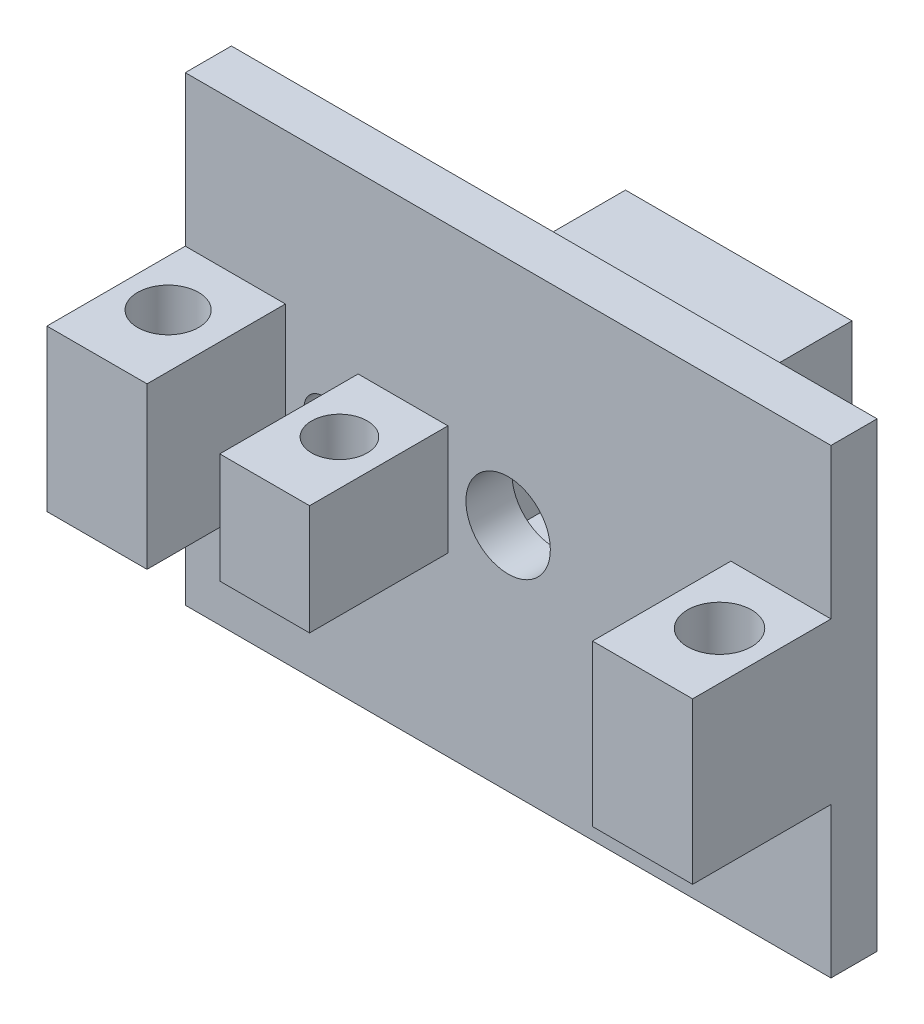
ISO-10303-21;
HEADER;
FILE_DESCRIPTION(('STEP AP214'),'2;1');
FILE_NAME('part.step','',(''),(''),'','','');
FILE_SCHEMA(('AUTOMOTIVE_DESIGN { 1 0 10303 214 1 1 1 1 }'));
ENDSEC;
DATA;
#1=APPLICATION_CONTEXT('core data for automotive mechanical design processes');
#2=APPLICATION_PROTOCOL_DEFINITION('international standard','automotive_design',2000,#1);
#3=PRODUCT_CONTEXT('',#1,'mechanical');
#4=PRODUCT('Part','Part','',(#3));
#5=PRODUCT_RELATED_PRODUCT_CATEGORY('part','',(#4));
#6=PRODUCT_DEFINITION_FORMATION('','',#4);
#7=PRODUCT_DEFINITION_CONTEXT('part definition',#1,'design');
#8=PRODUCT_DEFINITION('design','',#6,#7);
#9=PRODUCT_DEFINITION_SHAPE('','',#8);
#10=(LENGTH_UNIT() NAMED_UNIT(*) SI_UNIT(.MILLI.,.METRE.));
#11=(NAMED_UNIT(*) PLANE_ANGLE_UNIT() SI_UNIT($,.RADIAN.));
#12=(NAMED_UNIT(*) SI_UNIT($,.STERADIAN.) SOLID_ANGLE_UNIT());
#13=UNCERTAINTY_MEASURE_WITH_UNIT(LENGTH_MEASURE(1.E-05),#10,'distance_accuracy_value','');
#14=(GEOMETRIC_REPRESENTATION_CONTEXT(3) GLOBAL_UNCERTAINTY_ASSIGNED_CONTEXT((#13)) GLOBAL_UNIT_ASSIGNED_CONTEXT((#10,
#11,#12)) REPRESENTATION_CONTEXT('',''));
#15=CARTESIAN_POINT('',(0.,0.,0.));
#16=DIRECTION('',(0.,0.,1.));
#17=DIRECTION('',(1.,0.,0.));
#18=AXIS2_PLACEMENT_3D('',#15,#16,#17);
#19=CARTESIAN_POINT('',(0.,0.,10.));
#20=DIRECTION('',(0.,0.,-1.));
#21=DIRECTION('',(-1.,0.,0.));
#22=AXIS2_PLACEMENT_3D('',#19,#20,#21);
#23=PLANE('',#22);
#24=DIRECTION('',(1.,0.,0.));
#25=VECTOR('',#24,1.);
#26=CARTESIAN_POINT('',(48.2903830857398,-17.4173117443862,10.));
#27=LINE('',#26,#25);
#28=CARTESIAN_POINT('',(48.2903830857398,-17.4173117443862,10.));
#29=VERTEX_POINT('',#28);
#30=CARTESIAN_POINT('',(70.,-17.4173117443862,10.));
#31=VERTEX_POINT('',#30);
#32=EDGE_CURVE('E245',#29,#31,#27,.T.);
#33=ORIENTED_EDGE('',*,*,#32,.F.);
#34=DIRECTION('',(0.,-1.,0.));
#35=VECTOR('',#34,1.);
#36=CARTESIAN_POINT('',(48.2903830857398,-17.4173117443862,10.));
#37=LINE('',#36,#35);
#38=CARTESIAN_POINT('',(48.2903830857398,17.4173117443862,10.));
#39=VERTEX_POINT('',#38);
#40=EDGE_CURVE('E249',#39,#29,#37,.T.);
#41=ORIENTED_EDGE('',*,*,#40,.F.);
#42=DIRECTION('',(-1.,0.,0.));
#43=VECTOR('',#42,1.);
#44=CARTESIAN_POINT('',(48.2903830857398,17.4173117443862,10.));
#45=LINE('',#44,#43);
#46=CARTESIAN_POINT('',(70.,17.4173117443862,10.));
#47=VERTEX_POINT('',#46);
#48=EDGE_CURVE('E242',#47,#39,#45,.T.);
#49=ORIENTED_EDGE('',*,*,#48,.F.);
#50=DIRECTION('',(0.,1.,0.));
#51=VECTOR('',#50,1.);
#52=CARTESIAN_POINT('',(70.,-50.,10.));
#53=LINE('',#52,#51);
#54=CARTESIAN_POINT('',(70.,50.,10.));
#55=VERTEX_POINT('',#54);
#56=EDGE_CURVE('E369',#47,#55,#53,.T.);
#57=ORIENTED_EDGE('',*,*,#56,.T.);
#58=DIRECTION('',(-1.,0.,0.));
#59=VECTOR('',#58,1.);
#60=CARTESIAN_POINT('',(-70.,50.,10.));
#61=LINE('',#60,#59);
#62=CARTESIAN_POINT('',(-70.,50.,10.));
#63=VERTEX_POINT('',#62);
#64=EDGE_CURVE('E368',#55,#63,#61,.T.);
#65=ORIENTED_EDGE('',*,*,#64,.T.);
#66=DIRECTION('',(0.,-1.,0.));
#67=VECTOR('',#66,1.);
#68=CARTESIAN_POINT('',(-70.,-50.,10.));
#69=LINE('',#68,#67);
#70=CARTESIAN_POINT('',(-70.,17.4173117443862,10.));
#71=VERTEX_POINT('',#70);
#72=EDGE_CURVE('E372',#63,#71,#69,.T.);
#73=ORIENTED_EDGE('',*,*,#72,.T.);
#74=DIRECTION('',(-1.,0.,0.));
#75=VECTOR('',#74,1.);
#76=CARTESIAN_POINT('',(-48.2903830857398,17.4173117443862,10.));
#77=LINE('',#76,#75);
#78=CARTESIAN_POINT('',(-48.2903830857398,17.4173117443862,10.));
#79=VERTEX_POINT('',#78);
#80=EDGE_CURVE('E264',#79,#71,#77,.T.);
#81=ORIENTED_EDGE('',*,*,#80,.F.);
#82=DIRECTION('',(0.,1.,0.));
#83=VECTOR('',#82,1.);
#84=CARTESIAN_POINT('',(-48.2903830857398,-17.4173117443862,10.));
#85=LINE('',#84,#83);
#86=CARTESIAN_POINT('',(-48.2903830857398,-17.4173117443862,10.));
#87=VERTEX_POINT('',#86);
#88=EDGE_CURVE('E273',#87,#79,#85,.T.);
#89=ORIENTED_EDGE('',*,*,#88,.F.);
#90=DIRECTION('',(1.,0.,0.));
#91=VECTOR('',#90,1.);
#92=CARTESIAN_POINT('',(-48.2903830857398,-17.4173117443862,10.));
#93=LINE('',#92,#91);
#94=CARTESIAN_POINT('',(-70.,-17.4173117443862,10.));
#95=VERTEX_POINT('',#94);
#96=EDGE_CURVE('E252',#95,#87,#93,.T.);
#97=ORIENTED_EDGE('',*,*,#96,.F.);
#98=CARTESIAN_POINT('',(-70.,-50.,10.));
#99=VERTEX_POINT('',#98);
#100=EDGE_CURVE('E371',#95,#99,#69,.T.);
#101=ORIENTED_EDGE('',*,*,#100,.T.);
#102=DIRECTION('',(1.,0.,0.));
#103=VECTOR('',#102,1.);
#104=CARTESIAN_POINT('',(-70.,-50.,10.));
#105=LINE('',#104,#103);
#106=CARTESIAN_POINT('',(70.,-50.,10.));
#107=VERTEX_POINT('',#106);
#108=EDGE_CURVE('E374',#99,#107,#105,.T.);
#109=ORIENTED_EDGE('',*,*,#108,.T.);
#110=EDGE_CURVE('E366',#107,#31,#53,.T.);
#111=ORIENTED_EDGE('',*,*,#110,.T.);
#112=EDGE_LOOP('',(#33,#41,#49,#57,#65,#73,#81,#89,#97,#101,#109,#111));
#113=FACE_BOUND('',#112,.T.);
#114=CARTESIAN_POINT('',(0.,0.,10.));
#115=DIRECTION('',(0.,0.,1.));
#116=DIRECTION('',(1.,0.,0.));
#117=AXIS2_PLACEMENT_3D('',#114,#115,#116);
#118=CIRCLE('',#117,9.15163960888216);
#119=CARTESIAN_POINT('',(9.15163960888217,0.,10.));
#120=VERTEX_POINT('',#119);
#121=EDGE_CURVE('E348',#120,#120,#118,.T.);
#122=ORIENTED_EDGE('',*,*,#121,.F.);
#123=EDGE_LOOP('',(#122));
#124=FACE_BOUND('',#123,.T.);
#125=CARTESIAN_POINT('',(40.,0.,10.));
#126=DIRECTION('',(0.,0.,1.));
#127=DIRECTION('',(-1.,0.,0.));
#128=AXIS2_PLACEMENT_3D('',#125,#126,#127);
#129=CIRCLE('',#128,4.25);
#130=CARTESIAN_POINT('',(35.75,0.,10.));
#131=VERTEX_POINT('',#130);
#132=EDGE_CURVE('E354',#131,#131,#129,.T.);
#133=ORIENTED_EDGE('',*,*,#132,.F.);
#134=EDGE_LOOP('',(#133));
#135=FACE_BOUND('',#134,.T.);
#136=CARTESIAN_POINT('',(-40.,0.,10.));
#137=DIRECTION('',(0.,0.,1.));
#138=DIRECTION('',(1.,0.,0.));
#139=AXIS2_PLACEMENT_3D('',#136,#137,#138);
#140=CIRCLE('',#139,4.25);
#141=CARTESIAN_POINT('',(-35.75,0.,10.));
#142=VERTEX_POINT('',#141);
#143=EDGE_CURVE('E360',#142,#142,#140,.T.);
#144=ORIENTED_EDGE('',*,*,#143,.F.);
#145=EDGE_LOOP('',(#144));
#146=FACE_BOUND('',#145,.T.);
#147=DIRECTION('',(0.,1.,0.));
#148=VECTOR('',#147,1.);
#149=CARTESIAN_POINT('',(-13.0498287945555,-11.7343218596206,10.));
#150=LINE('',#149,#148);
#151=CARTESIAN_POINT('',(-13.0498287945555,-11.7343218596206,10.));
#152=VERTEX_POINT('',#151);
#153=CARTESIAN_POINT('',(-13.0498287945555,12.1552840787998,10.));
#154=VERTEX_POINT('',#153);
#155=EDGE_CURVE('E195',#152,#154,#150,.T.);
#156=ORIENTED_EDGE('',*,*,#155,.F.);
#157=DIRECTION('',(1.,0.,0.));
#158=VECTOR('',#157,1.);
#159=CARTESIAN_POINT('',(-32.519331431594,-11.7343218596206,10.));
#160=LINE('',#159,#158);
#161=CARTESIAN_POINT('',(-32.519331431594,-11.7343218596206,10.));
#162=VERTEX_POINT('',#161);
#163=EDGE_CURVE('E197',#162,#152,#160,.T.);
#164=ORIENTED_EDGE('',*,*,#163,.F.);
#165=DIRECTION('',(0.,-1.,0.));
#166=VECTOR('',#165,1.);
#167=CARTESIAN_POINT('',(-32.519331431594,-11.7343218596206,10.));
#168=LINE('',#167,#166);
#169=CARTESIAN_POINT('',(-32.519331431594,12.1552840787998,10.));
#170=VERTEX_POINT('',#169);
#171=EDGE_CURVE('E58',#170,#162,#168,.T.);
#172=ORIENTED_EDGE('',*,*,#171,.F.);
#173=DIRECTION('',(-1.,0.,0.));
#174=VECTOR('',#173,1.);
#175=CARTESIAN_POINT('',(-32.519331431594,12.1552840787998,10.));
#176=LINE('',#175,#174);
#177=EDGE_CURVE('E53',#154,#170,#176,.T.);
#178=ORIENTED_EDGE('',*,*,#177,.F.);
#179=EDGE_LOOP('',(#156,#164,#172,#178));
#180=FACE_BOUND('',#179,.T.);
#181=ADVANCED_FACE('F37',(#113,#124,#135,#146,#180),#23,.F.);
#182=CARTESIAN_POINT('',(0.,0.,0.));
#183=DIRECTION('',(0.,0.,-1.));
#184=DIRECTION('',(-1.,0.,0.));
#185=AXIS2_PLACEMENT_3D('',#182,#183,#184);
#186=PLANE('',#185);
#187=CARTESIAN_POINT('',(40.,0.,0.));
#188=DIRECTION('',(0.,0.,1.));
#189=DIRECTION('',(-1.,0.,0.));
#190=AXIS2_PLACEMENT_3D('',#187,#188,#189);
#191=CIRCLE('',#190,4.25);
#192=CARTESIAN_POINT('',(35.75,0.,0.));
#193=VERTEX_POINT('',#192);
#194=EDGE_CURVE('E351',#193,#193,#191,.T.);
#195=ORIENTED_EDGE('',*,*,#194,.T.);
#196=EDGE_LOOP('',(#195));
#197=FACE_BOUND('',#196,.T.);
#198=DIRECTION('',(0.,1.,0.));
#199=VECTOR('',#198,1.);
#200=CARTESIAN_POINT('',(70.,-50.,0.));
#201=LINE('',#200,#199);
#202=CARTESIAN_POINT('',(70.,-50.,0.));
#203=VERTEX_POINT('',#202);
#204=CARTESIAN_POINT('',(70.,50.,0.));
#205=VERTEX_POINT('',#204);
#206=EDGE_CURVE('E363',#203,#205,#201,.T.);
#207=ORIENTED_EDGE('',*,*,#206,.F.);
#208=DIRECTION('',(1.,0.,0.));
#209=VECTOR('',#208,1.);
#210=CARTESIAN_POINT('',(-70.,-50.,0.));
#211=LINE('',#210,#209);
#212=CARTESIAN_POINT('',(-70.,-50.,0.));
#213=VERTEX_POINT('',#212);
#214=EDGE_CURVE('E383',#213,#203,#211,.T.);
#215=ORIENTED_EDGE('',*,*,#214,.F.);
#216=DIRECTION('',(0.,-1.,0.));
#217=VECTOR('',#216,1.);
#218=CARTESIAN_POINT('',(-70.,-50.,0.));
#219=LINE('',#218,#217);
#220=CARTESIAN_POINT('',(-70.,50.,0.));
#221=VERTEX_POINT('',#220);
#222=EDGE_CURVE('E381',#221,#213,#219,.T.);
#223=ORIENTED_EDGE('',*,*,#222,.F.);
#224=DIRECTION('',(-1.,0.,0.));
#225=VECTOR('',#224,1.);
#226=CARTESIAN_POINT('',(-70.,50.,0.));
#227=LINE('',#226,#225);
#228=EDGE_CURVE('E379',#205,#221,#227,.T.);
#229=ORIENTED_EDGE('',*,*,#228,.F.);
#230=EDGE_LOOP('',(#207,#215,#223,#229));
#231=FACE_BOUND('',#230,.T.);
#232=CARTESIAN_POINT('',(-40.,0.,0.));
#233=DIRECTION('',(0.,0.,1.));
#234=DIRECTION('',(1.,0.,0.));
#235=AXIS2_PLACEMENT_3D('',#232,#233,#234);
#236=CIRCLE('',#235,4.25);
#237=CARTESIAN_POINT('',(-35.75,0.,0.));
#238=VERTEX_POINT('',#237);
#239=EDGE_CURVE('E357',#238,#238,#236,.T.);
#240=ORIENTED_EDGE('',*,*,#239,.T.);
#241=EDGE_LOOP('',(#240));
#242=FACE_BOUND('',#241,.T.);
#243=DIRECTION('',(-1.,0.,0.));
#244=VECTOR('',#243,1.);
#245=CARTESIAN_POINT('',(24.5535181227437,-25.6722517466818,0.));
#246=LINE('',#245,#244);
#247=CARTESIAN_POINT('',(24.5535181227437,-25.6722517466818,0.));
#248=VERTEX_POINT('',#247);
#249=CARTESIAN_POINT('',(-24.5535181227437,-25.6722517466818,0.));
#250=VERTEX_POINT('',#249);
#251=EDGE_CURVE('E332',#248,#250,#246,.T.);
#252=ORIENTED_EDGE('',*,*,#251,.F.);
#253=DIRECTION('',(0.,-1.,0.));
#254=VECTOR('',#253,1.);
#255=CARTESIAN_POINT('',(24.5535181227437,-25.6722517466818,0.));
#256=LINE('',#255,#254);
#257=CARTESIAN_POINT('',(24.5535181227437,25.6722517466818,0.));
#258=VERTEX_POINT('',#257);
#259=EDGE_CURVE('E318',#258,#248,#256,.T.);
#260=ORIENTED_EDGE('',*,*,#259,.F.);
#261=DIRECTION('',(1.,0.,0.));
#262=VECTOR('',#261,1.);
#263=CARTESIAN_POINT('',(24.5535181227437,25.6722517466818,0.));
#264=LINE('',#263,#262);
#265=CARTESIAN_POINT('',(-24.5535181227437,25.6722517466818,0.));
#266=VERTEX_POINT('',#265);
#267=EDGE_CURVE('E323',#266,#258,#264,.T.);
#268=ORIENTED_EDGE('',*,*,#267,.F.);
#269=DIRECTION('',(0.,1.,0.));
#270=VECTOR('',#269,1.);
#271=CARTESIAN_POINT('',(-24.5535181227437,-25.6722517466818,0.));
#272=LINE('',#271,#270);
#273=EDGE_CURVE('E334',#250,#266,#272,.T.);
#274=ORIENTED_EDGE('',*,*,#273,.F.);
#275=EDGE_LOOP('',(#252,#260,#268,#274));
#276=FACE_BOUND('',#275,.T.);
#277=ADVANCED_FACE('F402',(#197,#231,#242,#276),#186,.T.);
#278=DIRECTION('',(0.,1.,0.));
#279=VECTOR('',#278,1.);
#280=CARTESIAN_POINT('',(-19.5535181227437,-20.6722517466818,0.));
#281=LINE('',#280,#279);
#282=CARTESIAN_POINT('',(-19.5535181227437,-20.6722517466818,0.));
#283=VERTEX_POINT('',#282);
#284=CARTESIAN_POINT('',(-19.5535181227437,20.6722517466818,0.));
#285=VERTEX_POINT('',#284);
#286=EDGE_CURVE('E289',#283,#285,#281,.T.);
#287=ORIENTED_EDGE('',*,*,#286,.T.);
#288=DIRECTION('',(1.,0.,0.));
#289=VECTOR('',#288,1.);
#290=CARTESIAN_POINT('',(19.5535181227437,20.6722517466818,0.));
#291=LINE('',#290,#289);
#292=CARTESIAN_POINT('',(19.5535181227437,20.6722517466818,0.));
#293=VERTEX_POINT('',#292);
#294=EDGE_CURVE('E302',#285,#293,#291,.T.);
#295=ORIENTED_EDGE('',*,*,#294,.T.);
#296=DIRECTION('',(0.,-1.,0.));
#297=VECTOR('',#296,1.);
#298=CARTESIAN_POINT('',(19.5535181227437,-20.6722517466818,0.));
#299=LINE('',#298,#297);
#300=CARTESIAN_POINT('',(19.5535181227437,-20.6722517466818,0.));
#301=VERTEX_POINT('',#300);
#302=EDGE_CURVE('E304',#293,#301,#299,.T.);
#303=ORIENTED_EDGE('',*,*,#302,.T.);
#304=DIRECTION('',(-1.,0.,0.));
#305=VECTOR('',#304,1.);
#306=CARTESIAN_POINT('',(19.5535181227437,-20.6722517466818,0.));
#307=LINE('',#306,#305);
#308=EDGE_CURVE('E293',#301,#283,#307,.T.);
#309=ORIENTED_EDGE('',*,*,#308,.T.);
#310=EDGE_LOOP('',(#287,#295,#303,#309));
#311=FACE_BOUND('',#310,.T.);
#312=CARTESIAN_POINT('',(0.,0.,0.));
#313=DIRECTION('',(0.,0.,1.));
#314=DIRECTION('',(1.,0.,0.));
#315=AXIS2_PLACEMENT_3D('',#312,#313,#314);
#316=CIRCLE('',#315,9.15163960888216);
#317=CARTESIAN_POINT('',(9.15163960888217,0.,0.));
#318=VERTEX_POINT('',#317);
#319=EDGE_CURVE('E347',#318,#318,#316,.T.);
#320=ORIENTED_EDGE('',*,*,#319,.T.);
#321=EDGE_LOOP('',(#320));
#322=FACE_BOUND('',#321,.T.);
#323=ADVANCED_FACE('F436',(#311,#322),#186,.T.);
#324=CARTESIAN_POINT('',(70.,-50.,10.));
#325=DIRECTION('',(-1.,0.,0.));
#326=DIRECTION('',(0.,0.,1.));
#327=AXIS2_PLACEMENT_3D('',#324,#325,#326);
#328=PLANE('',#327);
#329=ORIENTED_EDGE('',*,*,#206,.T.);
#330=DIRECTION('',(0.,0.,-1.));
#331=VECTOR('',#330,1.);
#332=CARTESIAN_POINT('',(70.,50.,10.));
#333=LINE('',#332,#331);
#334=EDGE_CURVE('E11',#55,#205,#333,.T.);
#335=ORIENTED_EDGE('',*,*,#334,.F.);
#336=ORIENTED_EDGE('',*,*,#56,.F.);
#337=DIRECTION('',(0.,0.,-1.));
#338=VECTOR('',#337,1.);
#339=CARTESIAN_POINT('',(70.,17.4173117443862,40.));
#340=LINE('',#339,#338);
#341=CARTESIAN_POINT('',(70.,17.4173117443862,40.));
#342=VERTEX_POINT('',#341);
#343=EDGE_CURVE('E235',#342,#47,#340,.T.);
#344=ORIENTED_EDGE('',*,*,#343,.F.);
#345=DIRECTION('',(0.,1.,0.));
#346=VECTOR('',#345,1.);
#347=CARTESIAN_POINT('',(70.,-17.4173117443862,40.));
#348=LINE('',#347,#346);
#349=CARTESIAN_POINT('',(70.,-17.4173117443862,40.));
#350=VERTEX_POINT('',#349);
#351=EDGE_CURVE('E254',#350,#342,#348,.T.);
#352=ORIENTED_EDGE('',*,*,#351,.F.);
#353=DIRECTION('',(0.,0.,-1.));
#354=VECTOR('',#353,1.);
#355=CARTESIAN_POINT('',(70.,-17.4173117443862,40.));
#356=LINE('',#355,#354);
#357=EDGE_CURVE('E232',#350,#31,#356,.T.);
#358=ORIENTED_EDGE('',*,*,#357,.T.);
#359=ORIENTED_EDGE('',*,*,#110,.F.);
#360=DIRECTION('',(0.,0.,-1.));
#361=VECTOR('',#360,1.);
#362=CARTESIAN_POINT('',(70.,-50.,10.));
#363=LINE('',#362,#361);
#364=EDGE_CURVE('E376',#107,#203,#363,.T.);
#365=ORIENTED_EDGE('',*,*,#364,.T.);
#366=EDGE_LOOP('',(#329,#335,#336,#344,#352,#358,#359,#365));
#367=FACE_BOUND('',#366,.T.);
#368=ADVANCED_FACE('F39',(#367),#328,.F.);
#369=CARTESIAN_POINT('',(-70.,50.,10.));
#370=DIRECTION('',(0.,-1.,0.));
#371=DIRECTION('',(0.,0.,-1.));
#372=AXIS2_PLACEMENT_3D('',#369,#370,#371);
#373=PLANE('',#372);
#374=ORIENTED_EDGE('',*,*,#228,.T.);
#375=DIRECTION('',(0.,0.,-1.));
#376=VECTOR('',#375,1.);
#377=CARTESIAN_POINT('',(-70.,50.,10.));
#378=LINE('',#377,#376);
#379=EDGE_CURVE('E46',#63,#221,#378,.T.);
#380=ORIENTED_EDGE('',*,*,#379,.F.);
#381=ORIENTED_EDGE('',*,*,#64,.F.);
#382=ORIENTED_EDGE('',*,*,#334,.T.);
#383=EDGE_LOOP('',(#374,#380,#381,#382));
#384=FACE_BOUND('',#383,.T.);
#385=ADVANCED_FACE('F427',(#384),#373,.F.);
#386=CARTESIAN_POINT('',(-70.,-50.,10.));
#387=DIRECTION('',(1.,0.,0.));
#388=DIRECTION('',(0.,0.,-1.));
#389=AXIS2_PLACEMENT_3D('',#386,#387,#388);
#390=PLANE('',#389);
#391=ORIENTED_EDGE('',*,*,#222,.T.);
#392=DIRECTION('',(0.,0.,-1.));
#393=VECTOR('',#392,1.);
#394=CARTESIAN_POINT('',(-70.,-50.,10.));
#395=LINE('',#394,#393);
#396=EDGE_CURVE('E387',#99,#213,#395,.T.);
#397=ORIENTED_EDGE('',*,*,#396,.F.);
#398=ORIENTED_EDGE('',*,*,#100,.F.);
#399=DIRECTION('',(0.,0.,-1.));
#400=VECTOR('',#399,1.);
#401=CARTESIAN_POINT('',(-70.,-17.4173117443862,40.));
#402=LINE('',#401,#400);
#403=CARTESIAN_POINT('',(-70.,-17.4173117443862,40.));
#404=VERTEX_POINT('',#403);
#405=EDGE_CURVE('E286',#404,#95,#402,.T.);
#406=ORIENTED_EDGE('',*,*,#405,.F.);
#407=DIRECTION('',(0.,-1.,0.));
#408=VECTOR('',#407,1.);
#409=CARTESIAN_POINT('',(-70.,-17.4173117443862,40.));
#410=LINE('',#409,#408);
#411=CARTESIAN_POINT('',(-70.,17.4173117443862,40.));
#412=VERTEX_POINT('',#411);
#413=EDGE_CURVE('E260',#412,#404,#410,.T.);
#414=ORIENTED_EDGE('',*,*,#413,.F.);
#415=DIRECTION('',(0.,0.,-1.));
#416=VECTOR('',#415,1.);
#417=CARTESIAN_POINT('',(-70.,17.4173117443862,40.));
#418=LINE('',#417,#416);
#419=EDGE_CURVE('E270',#412,#71,#418,.T.);
#420=ORIENTED_EDGE('',*,*,#419,.T.);
#421=ORIENTED_EDGE('',*,*,#72,.F.);
#422=ORIENTED_EDGE('',*,*,#379,.T.);
#423=EDGE_LOOP('',(#391,#397,#398,#406,#414,#420,#421,#422));
#424=FACE_BOUND('',#423,.T.);
#425=ADVANCED_FACE('F395',(#424),#390,.F.);
#426=CARTESIAN_POINT('',(-70.,-50.,10.));
#427=DIRECTION('',(0.,1.,0.));
#428=DIRECTION('',(0.,0.,1.));
#429=AXIS2_PLACEMENT_3D('',#426,#427,#428);
#430=PLANE('',#429);
#431=ORIENTED_EDGE('',*,*,#214,.T.);
#432=ORIENTED_EDGE('',*,*,#364,.F.);
#433=ORIENTED_EDGE('',*,*,#108,.F.);
#434=ORIENTED_EDGE('',*,*,#396,.T.);
#435=EDGE_LOOP('',(#431,#432,#433,#434));
#436=FACE_BOUND('',#435,.T.);
#437=ADVANCED_FACE('F406',(#436),#430,.F.);
#438=CARTESIAN_POINT('',(-40.,0.,10.));
#439=DIRECTION('',(0.,0.,-1.));
#440=DIRECTION('',(-1.,0.,0.));
#441=AXIS2_PLACEMENT_3D('',#438,#439,#440);
#442=CYLINDRICAL_SURFACE('',#441,4.25);
#443=ORIENTED_EDGE('',*,*,#143,.T.);
#444=EDGE_LOOP('',(#443));
#445=FACE_BOUND('',#444,.T.);
#446=ORIENTED_EDGE('',*,*,#239,.F.);
#447=EDGE_LOOP('',(#446));
#448=FACE_BOUND('',#447,.T.);
#449=ADVANCED_FACE('F447',(#445,#448),#442,.F.);
#450=CARTESIAN_POINT('',(40.,0.,10.));
#451=DIRECTION('',(0.,0.,-1.));
#452=DIRECTION('',(-1.,0.,0.));
#453=AXIS2_PLACEMENT_3D('',#450,#451,#452);
#454=CYLINDRICAL_SURFACE('',#453,4.25);
#455=ORIENTED_EDGE('',*,*,#132,.T.);
#456=EDGE_LOOP('',(#455));
#457=FACE_BOUND('',#456,.T.);
#458=ORIENTED_EDGE('',*,*,#194,.F.);
#459=EDGE_LOOP('',(#458));
#460=FACE_BOUND('',#459,.T.);
#461=ADVANCED_FACE('F454',(#457,#460),#454,.F.);
#462=CARTESIAN_POINT('',(0.,0.,10.));
#463=DIRECTION('',(0.,0.,-1.));
#464=DIRECTION('',(-1.,0.,0.));
#465=AXIS2_PLACEMENT_3D('',#462,#463,#464);
#466=CYLINDRICAL_SURFACE('',#465,9.15163960888216);
#467=ORIENTED_EDGE('',*,*,#121,.T.);
#468=EDGE_LOOP('',(#467));
#469=FACE_BOUND('',#468,.T.);
#470=ORIENTED_EDGE('',*,*,#319,.F.);
#471=EDGE_LOOP('',(#470));
#472=FACE_BOUND('',#471,.T.);
#473=ADVANCED_FACE('F459',(#469,#472),#466,.F.);
#474=CARTESIAN_POINT('',(0.,0.,-40.));
#475=DIRECTION('',(0.,0.,1.));
#476=DIRECTION('',(1.,0.,0.));
#477=AXIS2_PLACEMENT_3D('',#474,#475,#476);
#478=PLANE('',#477);
#479=DIRECTION('',(0.,-1.,0.));
#480=VECTOR('',#479,1.);
#481=CARTESIAN_POINT('',(24.5535181227437,-25.6722517466818,-40.));
#482=LINE('',#481,#480);
#483=CARTESIAN_POINT('',(24.5535181227437,25.6722517466818,-40.));
#484=VERTEX_POINT('',#483);
#485=CARTESIAN_POINT('',(24.5535181227437,-25.6722517466818,-40.));
#486=VERTEX_POINT('',#485);
#487=EDGE_CURVE('E319',#484,#486,#482,.T.);
#488=ORIENTED_EDGE('',*,*,#487,.T.);
#489=DIRECTION('',(-1.,0.,0.));
#490=VECTOR('',#489,1.);
#491=CARTESIAN_POINT('',(24.5535181227437,-25.6722517466818,-40.));
#492=LINE('',#491,#490);
#493=CARTESIAN_POINT('',(-24.5535181227437,-25.6722517466818,-40.));
#494=VERTEX_POINT('',#493);
#495=EDGE_CURVE('E322',#486,#494,#492,.T.);
#496=ORIENTED_EDGE('',*,*,#495,.T.);
#497=DIRECTION('',(0.,1.,0.));
#498=VECTOR('',#497,1.);
#499=CARTESIAN_POINT('',(-24.5535181227437,-25.6722517466818,-40.));
#500=LINE('',#499,#498);
#501=CARTESIAN_POINT('',(-24.5535181227437,25.6722517466818,-40.));
#502=VERTEX_POINT('',#501);
#503=EDGE_CURVE('E325',#494,#502,#500,.T.);
#504=ORIENTED_EDGE('',*,*,#503,.T.);
#505=DIRECTION('',(1.,0.,0.));
#506=VECTOR('',#505,1.);
#507=CARTESIAN_POINT('',(24.5535181227437,25.6722517466818,-40.));
#508=LINE('',#507,#506);
#509=EDGE_CURVE('E327',#502,#484,#508,.T.);
#510=ORIENTED_EDGE('',*,*,#509,.T.);
#511=EDGE_LOOP('',(#488,#496,#504,#510));
#512=FACE_BOUND('',#511,.T.);
#513=DIRECTION('',(0.,1.,0.));
#514=VECTOR('',#513,1.);
#515=CARTESIAN_POINT('',(-19.5535181227437,-20.6722517466818,-40.));
#516=LINE('',#515,#514);
#517=CARTESIAN_POINT('',(-19.5535181227437,-20.6722517466818,-40.));
#518=VERTEX_POINT('',#517);
#519=CARTESIAN_POINT('',(-19.5535181227437,20.6722517466818,-40.));
#520=VERTEX_POINT('',#519);
#521=EDGE_CURVE('E290',#518,#520,#516,.T.);
#522=ORIENTED_EDGE('',*,*,#521,.F.);
#523=DIRECTION('',(-1.,0.,0.));
#524=VECTOR('',#523,1.);
#525=CARTESIAN_POINT('',(19.5535181227437,-20.6722517466818,-40.));
#526=LINE('',#525,#524);
#527=CARTESIAN_POINT('',(19.5535181227437,-20.6722517466818,-40.));
#528=VERTEX_POINT('',#527);
#529=EDGE_CURVE('E298',#528,#518,#526,.T.);
#530=ORIENTED_EDGE('',*,*,#529,.F.);
#531=DIRECTION('',(0.,-1.,0.));
#532=VECTOR('',#531,1.);
#533=CARTESIAN_POINT('',(19.5535181227437,-20.6722517466818,-40.));
#534=LINE('',#533,#532);
#535=CARTESIAN_POINT('',(19.5535181227437,20.6722517466818,-40.));
#536=VERTEX_POINT('',#535);
#537=EDGE_CURVE('E295',#536,#528,#534,.T.);
#538=ORIENTED_EDGE('',*,*,#537,.F.);
#539=DIRECTION('',(1.,0.,0.));
#540=VECTOR('',#539,1.);
#541=CARTESIAN_POINT('',(19.5535181227437,20.6722517466818,-40.));
#542=LINE('',#541,#540);
#543=EDGE_CURVE('E292',#520,#536,#542,.T.);
#544=ORIENTED_EDGE('',*,*,#543,.F.);
#545=EDGE_LOOP('',(#522,#530,#538,#544));
#546=FACE_BOUND('',#545,.T.);
#547=ADVANCED_FACE('F479',(#512,#546),#478,.F.);
#548=CARTESIAN_POINT('',(24.5535181227437,-25.6722517466818,-40.));
#549=DIRECTION('',(-1.,0.,0.));
#550=DIRECTION('',(0.,0.,1.));
#551=AXIS2_PLACEMENT_3D('',#548,#549,#550);
#552=PLANE('',#551);
#553=ORIENTED_EDGE('',*,*,#259,.T.);
#554=DIRECTION('',(0.,0.,1.));
#555=VECTOR('',#554,1.);
#556=CARTESIAN_POINT('',(24.5535181227437,-25.6722517466818,-40.));
#557=LINE('',#556,#555);
#558=EDGE_CURVE('E345',#486,#248,#557,.T.);
#559=ORIENTED_EDGE('',*,*,#558,.F.);
#560=ORIENTED_EDGE('',*,*,#487,.F.);
#561=DIRECTION('',(0.,0.,1.));
#562=VECTOR('',#561,1.);
#563=CARTESIAN_POINT('',(24.5535181227437,25.6722517466818,-40.));
#564=LINE('',#563,#562);
#565=EDGE_CURVE('E329',#484,#258,#564,.T.);
#566=ORIENTED_EDGE('',*,*,#565,.T.);
#567=EDGE_LOOP('',(#553,#559,#560,#566));
#568=FACE_BOUND('',#567,.T.);
#569=ADVANCED_FACE('F484',(#568),#552,.F.);
#570=CARTESIAN_POINT('',(24.5535181227437,-25.6722517466818,-40.));
#571=DIRECTION('',(0.,1.,0.));
#572=DIRECTION('',(0.,0.,1.));
#573=AXIS2_PLACEMENT_3D('',#570,#571,#572);
#574=PLANE('',#573);
#575=ORIENTED_EDGE('',*,*,#251,.T.);
#576=DIRECTION('',(0.,0.,1.));
#577=VECTOR('',#576,1.);
#578=CARTESIAN_POINT('',(-24.5535181227437,-25.6722517466818,-40.));
#579=LINE('',#578,#577);
#580=EDGE_CURVE('E342',#494,#250,#579,.T.);
#581=ORIENTED_EDGE('',*,*,#580,.F.);
#582=ORIENTED_EDGE('',*,*,#495,.F.);
#583=ORIENTED_EDGE('',*,*,#558,.T.);
#584=EDGE_LOOP('',(#575,#581,#582,#583));
#585=FACE_BOUND('',#584,.T.);
#586=ADVANCED_FACE('F471',(#585),#574,.F.);
#587=CARTESIAN_POINT('',(-24.5535181227437,-25.6722517466818,-40.));
#588=DIRECTION('',(1.,0.,0.));
#589=DIRECTION('',(0.,1.,0.));
#590=AXIS2_PLACEMENT_3D('',#587,#588,#589);
#591=PLANE('',#590);
#592=ORIENTED_EDGE('',*,*,#273,.T.);
#593=DIRECTION('',(0.,0.,1.));
#594=VECTOR('',#593,1.);
#595=CARTESIAN_POINT('',(-24.5535181227437,25.6722517466818,-40.));
#596=LINE('',#595,#594);
#597=EDGE_CURVE('E340',#502,#266,#596,.T.);
#598=ORIENTED_EDGE('',*,*,#597,.F.);
#599=ORIENTED_EDGE('',*,*,#503,.F.);
#600=ORIENTED_EDGE('',*,*,#580,.T.);
#601=EDGE_LOOP('',(#592,#598,#599,#600));
#602=FACE_BOUND('',#601,.T.);
#603=ADVANCED_FACE('F475',(#602),#591,.F.);
#604=CARTESIAN_POINT('',(24.5535181227437,25.6722517466818,-40.));
#605=DIRECTION('',(0.,-1.,0.));
#606=DIRECTION('',(1.,0.,0.));
#607=AXIS2_PLACEMENT_3D('',#604,#605,#606);
#608=PLANE('',#607);
#609=ORIENTED_EDGE('',*,*,#267,.T.);
#610=ORIENTED_EDGE('',*,*,#565,.F.);
#611=ORIENTED_EDGE('',*,*,#509,.F.);
#612=ORIENTED_EDGE('',*,*,#597,.T.);
#613=EDGE_LOOP('',(#609,#610,#611,#612));
#614=FACE_BOUND('',#613,.T.);
#615=ADVANCED_FACE('F486',(#614),#608,.F.);
#616=CARTESIAN_POINT('',(-19.5535181227437,-20.6722517466818,-40.));
#617=DIRECTION('',(1.,0.,0.));
#618=DIRECTION('',(0.,0.,-1.));
#619=AXIS2_PLACEMENT_3D('',#616,#617,#618);
#620=PLANE('',#619);
#621=ORIENTED_EDGE('',*,*,#286,.F.);
#622=DIRECTION('',(0.,0.,1.));
#623=VECTOR('',#622,1.);
#624=CARTESIAN_POINT('',(-19.5535181227437,-20.6722517466818,-40.));
#625=LINE('',#624,#623);
#626=EDGE_CURVE('E300',#518,#283,#625,.T.);
#627=ORIENTED_EDGE('',*,*,#626,.F.);
#628=ORIENTED_EDGE('',*,*,#521,.T.);
#629=DIRECTION('',(0.,0.,1.));
#630=VECTOR('',#629,1.);
#631=CARTESIAN_POINT('',(-19.5535181227437,20.6722517466818,-40.));
#632=LINE('',#631,#630);
#633=EDGE_CURVE('E315',#520,#285,#632,.T.);
#634=ORIENTED_EDGE('',*,*,#633,.T.);
#635=EDGE_LOOP('',(#621,#627,#628,#634));
#636=FACE_BOUND('',#635,.T.);
#637=ADVANCED_FACE('F488',(#636),#620,.T.);
#638=CARTESIAN_POINT('',(19.5535181227437,20.6722517466818,-40.));
#639=DIRECTION('',(0.,-1.,0.));
#640=DIRECTION('',(0.,0.,-1.));
#641=AXIS2_PLACEMENT_3D('',#638,#639,#640);
#642=PLANE('',#641);
#643=ORIENTED_EDGE('',*,*,#294,.F.);
#644=ORIENTED_EDGE('',*,*,#633,.F.);
#645=ORIENTED_EDGE('',*,*,#543,.T.);
#646=DIRECTION('',(0.,0.,1.));
#647=VECTOR('',#646,1.);
#648=CARTESIAN_POINT('',(19.5535181227437,20.6722517466818,-40.));
#649=LINE('',#648,#647);
#650=EDGE_CURVE('E312',#536,#293,#649,.T.);
#651=ORIENTED_EDGE('',*,*,#650,.T.);
#652=EDGE_LOOP('',(#643,#644,#645,#651));
#653=FACE_BOUND('',#652,.T.);
#654=ADVANCED_FACE('F494',(#653),#642,.T.);
#655=CARTESIAN_POINT('',(19.5535181227437,-20.6722517466818,-40.));
#656=DIRECTION('',(-1.,0.,0.));
#657=DIRECTION('',(0.,0.,1.));
#658=AXIS2_PLACEMENT_3D('',#655,#656,#657);
#659=PLANE('',#658);
#660=ORIENTED_EDGE('',*,*,#302,.F.);
#661=ORIENTED_EDGE('',*,*,#650,.F.);
#662=ORIENTED_EDGE('',*,*,#537,.T.);
#663=DIRECTION('',(0.,0.,1.));
#664=VECTOR('',#663,1.);
#665=CARTESIAN_POINT('',(19.5535181227437,-20.6722517466818,-40.));
#666=LINE('',#665,#664);
#667=EDGE_CURVE('E309',#528,#301,#666,.T.);
#668=ORIENTED_EDGE('',*,*,#667,.T.);
#669=EDGE_LOOP('',(#660,#661,#662,#668));
#670=FACE_BOUND('',#669,.T.);
#671=ADVANCED_FACE('F555',(#670),#659,.T.);
#672=CARTESIAN_POINT('',(19.5535181227437,-20.6722517466818,-40.));
#673=DIRECTION('',(0.,1.,0.));
#674=DIRECTION('',(0.,0.,1.));
#675=AXIS2_PLACEMENT_3D('',#672,#673,#674);
#676=PLANE('',#675);
#677=ORIENTED_EDGE('',*,*,#308,.F.);
#678=ORIENTED_EDGE('',*,*,#667,.F.);
#679=ORIENTED_EDGE('',*,*,#529,.T.);
#680=ORIENTED_EDGE('',*,*,#626,.T.);
#681=EDGE_LOOP('',(#677,#678,#679,#680));
#682=FACE_BOUND('',#681,.T.);
#683=ADVANCED_FACE('F565',(#682),#676,.T.);
#684=CARTESIAN_POINT('',(-48.2903830857398,-17.4173117443862,40.));
#685=DIRECTION('',(0.,1.,0.));
#686=DIRECTION('',(0.,0.,1.));
#687=AXIS2_PLACEMENT_3D('',#684,#685,#686);
#688=PLANE('',#687);
#689=CARTESIAN_POINT('',(-59.8818754232971,-17.4173117443862,23.8369855595373));
#690=DIRECTION('',(0.,1.,0.));
#691=DIRECTION('',(0.,0.,1.));
#692=AXIS2_PLACEMENT_3D('',#689,#690,#691);
#693=CIRCLE('',#692,6.60924087601623);
#694=CARTESIAN_POINT('',(-59.8818754232971,-17.4173117443862,30.4462264355535));
#695=VERTEX_POINT('',#694);
#696=EDGE_CURVE('E864',#695,#695,#693,.T.);
#697=ORIENTED_EDGE('',*,*,#696,.T.);
#698=EDGE_LOOP('',(#697));
#699=FACE_BOUND('',#698,.T.);
#700=ORIENTED_EDGE('',*,*,#96,.T.);
#701=DIRECTION('',(0.,0.,-1.));
#702=VECTOR('',#701,1.);
#703=CARTESIAN_POINT('',(-48.2903830857398,-17.4173117443862,40.));
#704=LINE('',#703,#702);
#705=CARTESIAN_POINT('',(-48.2903830857398,-17.4173117443862,40.));
#706=VERTEX_POINT('',#705);
#707=EDGE_CURVE('E283',#706,#87,#704,.T.);
#708=ORIENTED_EDGE('',*,*,#707,.F.);
#709=DIRECTION('',(1.,0.,0.));
#710=VECTOR('',#709,1.);
#711=CARTESIAN_POINT('',(-48.2903830857398,-17.4173117443862,40.));
#712=LINE('',#711,#710);
#713=EDGE_CURVE('E263',#404,#706,#712,.T.);
#714=ORIENTED_EDGE('',*,*,#713,.F.);
#715=ORIENTED_EDGE('',*,*,#405,.T.);
#716=EDGE_LOOP('',(#700,#708,#714,#715));
#717=FACE_BOUND('',#716,.T.);
#718=ADVANCED_FACE('F575',(#699,#717),#688,.F.);
#719=CARTESIAN_POINT('',(-48.2903830857398,-17.4173117443862,40.));
#720=DIRECTION('',(-1.,0.,0.));
#721=DIRECTION('',(0.,0.,1.));
#722=AXIS2_PLACEMENT_3D('',#719,#720,#721);
#723=PLANE('',#722);
#724=ORIENTED_EDGE('',*,*,#88,.T.);
#725=DIRECTION('',(0.,0.,-1.));
#726=VECTOR('',#725,1.);
#727=CARTESIAN_POINT('',(-48.2903830857398,17.4173117443862,40.));
#728=LINE('',#727,#726);
#729=CARTESIAN_POINT('',(-48.2903830857398,17.4173117443862,40.));
#730=VERTEX_POINT('',#729);
#731=EDGE_CURVE('E280',#730,#79,#728,.T.);
#732=ORIENTED_EDGE('',*,*,#731,.F.);
#733=DIRECTION('',(0.,1.,0.));
#734=VECTOR('',#733,1.);
#735=CARTESIAN_POINT('',(-48.2903830857398,-17.4173117443862,40.));
#736=LINE('',#735,#734);
#737=EDGE_CURVE('E266',#706,#730,#736,.T.);
#738=ORIENTED_EDGE('',*,*,#737,.F.);
#739=ORIENTED_EDGE('',*,*,#707,.T.);
#740=EDGE_LOOP('',(#724,#732,#738,#739));
#741=FACE_BOUND('',#740,.T.);
#742=ADVANCED_FACE('F599',(#741),#723,.F.);
#743=CARTESIAN_POINT('',(-48.2903830857398,17.4173117443862,40.));
#744=DIRECTION('',(0.,-1.,0.));
#745=DIRECTION('',(0.,0.,-1.));
#746=AXIS2_PLACEMENT_3D('',#743,#744,#745);
#747=PLANE('',#746);
#748=CARTESIAN_POINT('',(-59.8818754232971,17.4173117443862,23.8369855595373));
#749=DIRECTION('',(0.,1.,0.));
#750=DIRECTION('',(0.,0.,1.));
#751=AXIS2_PLACEMENT_3D('',#748,#749,#750);
#752=CIRCLE('',#751,6.60924087601623);
#753=CARTESIAN_POINT('',(-59.8818754232971,17.4173117443862,30.4462264355535));
#754=VERTEX_POINT('',#753);
#755=EDGE_CURVE('E861',#754,#754,#752,.T.);
#756=ORIENTED_EDGE('',*,*,#755,.F.);
#757=EDGE_LOOP('',(#756));
#758=FACE_BOUND('',#757,.T.);
#759=ORIENTED_EDGE('',*,*,#80,.T.);
#760=ORIENTED_EDGE('',*,*,#419,.F.);
#761=DIRECTION('',(-1.,0.,0.));
#762=VECTOR('',#761,1.);
#763=CARTESIAN_POINT('',(-48.2903830857398,17.4173117443862,40.));
#764=LINE('',#763,#762);
#765=EDGE_CURVE('E268',#730,#412,#764,.T.);
#766=ORIENTED_EDGE('',*,*,#765,.F.);
#767=ORIENTED_EDGE('',*,*,#731,.T.);
#768=EDGE_LOOP('',(#759,#760,#766,#767));
#769=FACE_BOUND('',#768,.T.);
#770=ADVANCED_FACE('F608',(#758,#769),#747,.F.);
#771=CARTESIAN_POINT('',(0.,0.,40.));
#772=DIRECTION('',(0.,0.,1.));
#773=DIRECTION('',(1.,0.,0.));
#774=AXIS2_PLACEMENT_3D('',#771,#772,#773);
#775=PLANE('',#774);
#776=ORIENTED_EDGE('',*,*,#413,.T.);
#777=ORIENTED_EDGE('',*,*,#713,.T.);
#778=ORIENTED_EDGE('',*,*,#737,.T.);
#779=ORIENTED_EDGE('',*,*,#765,.T.);
#780=EDGE_LOOP('',(#776,#777,#778,#779));
#781=FACE_BOUND('',#780,.T.);
#782=ADVANCED_FACE('F616',(#781),#775,.T.);
#783=CARTESIAN_POINT('',(48.2903830857398,-17.4173117443862,40.));
#784=DIRECTION('',(1.,0.,0.));
#785=DIRECTION('',(0.,0.,-1.));
#786=AXIS2_PLACEMENT_3D('',#783,#784,#785);
#787=PLANE('',#786);
#788=ORIENTED_EDGE('',*,*,#40,.T.);
#789=DIRECTION('',(0.,0.,-1.));
#790=VECTOR('',#789,1.);
#791=CARTESIAN_POINT('',(48.2903830857398,-17.4173117443862,40.));
#792=LINE('',#791,#790);
#793=CARTESIAN_POINT('',(48.2903830857398,-17.4173117443862,40.));
#794=VERTEX_POINT('',#793);
#795=EDGE_CURVE('E201',#794,#29,#792,.T.);
#796=ORIENTED_EDGE('',*,*,#795,.F.);
#797=DIRECTION('',(0.,-1.,0.));
#798=VECTOR('',#797,1.);
#799=CARTESIAN_POINT('',(48.2903830857398,-17.4173117443862,40.));
#800=LINE('',#799,#798);
#801=CARTESIAN_POINT('',(48.2903830857398,17.4173117443862,40.));
#802=VERTEX_POINT('',#801);
#803=EDGE_CURVE('E246',#802,#794,#800,.T.);
#804=ORIENTED_EDGE('',*,*,#803,.F.);
#805=DIRECTION('',(0.,0.,-1.));
#806=VECTOR('',#805,1.);
#807=CARTESIAN_POINT('',(48.2903830857398,17.4173117443862,40.));
#808=LINE('',#807,#806);
#809=EDGE_CURVE('E238',#802,#39,#808,.T.);
#810=ORIENTED_EDGE('',*,*,#809,.T.);
#811=EDGE_LOOP('',(#788,#796,#804,#810));
#812=FACE_BOUND('',#811,.T.);
#813=ADVANCED_FACE('F420',(#812),#787,.F.);
#814=CARTESIAN_POINT('',(48.2903830857398,-17.4173117443862,40.));
#815=DIRECTION('',(0.,1.,0.));
#816=DIRECTION('',(0.,0.,1.));
#817=AXIS2_PLACEMENT_3D('',#814,#815,#816);
#818=PLANE('',#817);
#819=CARTESIAN_POINT('',(59.6713943146036,-17.4173117443862,23.8369855595373));
#820=DIRECTION('',(0.,1.,0.));
#821=DIRECTION('',(0.,0.,1.));
#822=AXIS2_PLACEMENT_3D('',#819,#820,#821);
#823=CIRCLE('',#822,6.93789923661666);
#824=CARTESIAN_POINT('',(59.6713943146036,-17.4173117443862,30.774884796154));
#825=VERTEX_POINT('',#824);
#826=EDGE_CURVE('E866',#825,#825,#823,.T.);
#827=ORIENTED_EDGE('',*,*,#826,.T.);
#828=EDGE_LOOP('',(#827));
#829=FACE_BOUND('',#828,.T.);
#830=ORIENTED_EDGE('',*,*,#32,.T.);
#831=ORIENTED_EDGE('',*,*,#357,.F.);
#832=DIRECTION('',(1.,0.,0.));
#833=VECTOR('',#832,1.);
#834=CARTESIAN_POINT('',(48.2903830857398,-17.4173117443862,40.));
#835=LINE('',#834,#833);
#836=EDGE_CURVE('E256',#794,#350,#835,.T.);
#837=ORIENTED_EDGE('',*,*,#836,.F.);
#838=ORIENTED_EDGE('',*,*,#795,.T.);
#839=EDGE_LOOP('',(#830,#831,#837,#838));
#840=FACE_BOUND('',#839,.T.);
#841=ADVANCED_FACE('F416',(#829,#840),#818,.F.);
#842=CARTESIAN_POINT('',(48.2903830857398,17.4173117443862,40.));
#843=DIRECTION('',(0.,-1.,0.));
#844=DIRECTION('',(0.,0.,-1.));
#845=AXIS2_PLACEMENT_3D('',#842,#843,#844);
#846=PLANE('',#845);
#847=CARTESIAN_POINT('',(59.6713943146036,17.4173117443862,23.8369855595373));
#848=DIRECTION('',(0.,1.,0.));
#849=DIRECTION('',(0.,0.,1.));
#850=AXIS2_PLACEMENT_3D('',#847,#848,#849);
#851=CIRCLE('',#850,6.93789923661666);
#852=CARTESIAN_POINT('',(59.6713943146036,17.4173117443862,30.774884796154));
#853=VERTEX_POINT('',#852);
#854=EDGE_CURVE('E879',#853,#853,#851,.T.);
#855=ORIENTED_EDGE('',*,*,#854,.F.);
#856=EDGE_LOOP('',(#855));
#857=FACE_BOUND('',#856,.T.);
#858=ORIENTED_EDGE('',*,*,#48,.T.);
#859=ORIENTED_EDGE('',*,*,#809,.F.);
#860=DIRECTION('',(-1.,0.,0.));
#861=VECTOR('',#860,1.);
#862=CARTESIAN_POINT('',(48.2903830857398,17.4173117443862,40.));
#863=LINE('',#862,#861);
#864=EDGE_CURVE('E241',#342,#802,#863,.T.);
#865=ORIENTED_EDGE('',*,*,#864,.F.);
#866=ORIENTED_EDGE('',*,*,#343,.T.);
#867=EDGE_LOOP('',(#858,#859,#865,#866));
#868=FACE_BOUND('',#867,.T.);
#869=ADVANCED_FACE('F424',(#857,#868),#846,.F.);
#870=CARTESIAN_POINT('',(0.,0.,40.));
#871=DIRECTION('',(0.,0.,-1.));
#872=DIRECTION('',(-1.,0.,0.));
#873=AXIS2_PLACEMENT_3D('',#870,#871,#872);
#874=PLANE('',#873);
#875=ORIENTED_EDGE('',*,*,#803,.T.);
#876=ORIENTED_EDGE('',*,*,#836,.T.);
#877=ORIENTED_EDGE('',*,*,#351,.T.);
#878=ORIENTED_EDGE('',*,*,#864,.T.);
#879=EDGE_LOOP('',(#875,#876,#877,#878));
#880=FACE_BOUND('',#879,.T.);
#881=ADVANCED_FACE('F644',(#880),#874,.F.);
#882=CARTESIAN_POINT('',(-13.0498287945555,-11.7343218596206,40.));
#883=DIRECTION('',(-1.,0.,0.));
#884=DIRECTION('',(0.,0.,1.));
#885=AXIS2_PLACEMENT_3D('',#882,#883,#884);
#886=PLANE('',#885);
#887=ORIENTED_EDGE('',*,*,#155,.T.);
#888=DIRECTION('',(0.,0.,-1.));
#889=VECTOR('',#888,1.);
#890=CARTESIAN_POINT('',(-13.0498287945555,12.1552840787998,40.));
#891=LINE('',#890,#889);
#892=CARTESIAN_POINT('',(-13.0498287945555,12.1552840787998,40.));
#893=VERTEX_POINT('',#892);
#894=EDGE_CURVE('E865',#893,#154,#891,.T.);
#895=ORIENTED_EDGE('',*,*,#894,.F.);
#896=DIRECTION('',(0.,1.,0.));
#897=VECTOR('',#896,1.);
#898=CARTESIAN_POINT('',(-13.0498287945555,-11.7343218596206,40.));
#899=LINE('',#898,#897);
#900=CARTESIAN_POINT('',(-13.0498287945555,-11.7343218596206,40.));
#901=VERTEX_POINT('',#900);
#902=EDGE_CURVE('E212',#901,#893,#899,.T.);
#903=ORIENTED_EDGE('',*,*,#902,.F.);
#904=DIRECTION('',(0.,0.,-1.));
#905=VECTOR('',#904,1.);
#906=CARTESIAN_POINT('',(-13.0498287945555,-11.7343218596206,40.));
#907=LINE('',#906,#905);
#908=EDGE_CURVE('E208',#901,#152,#907,.T.);
#909=ORIENTED_EDGE('',*,*,#908,.T.);
#910=EDGE_LOOP('',(#887,#895,#903,#909));
#911=FACE_BOUND('',#910,.T.);
#912=ADVANCED_FACE('F214',(#911),#886,.F.);
#913=CARTESIAN_POINT('',(-32.519331431594,12.1552840787998,40.));
#914=DIRECTION('',(0.,-1.,0.));
#915=DIRECTION('',(0.,0.,-1.));
#916=AXIS2_PLACEMENT_3D('',#913,#914,#915);
#917=PLANE('',#916);
#918=CARTESIAN_POINT('',(-22.7319597388966,12.1552840787998,23.8369855595373));
#919=DIRECTION('',(0.,-1.,0.));
#920=DIRECTION('',(0.,0.,-1.));
#921=AXIS2_PLACEMENT_3D('',#918,#919,#920);
#922=CIRCLE('',#921,6.03185390300565);
#923=CARTESIAN_POINT('',(-22.7319597388966,12.1552840787998,17.8051316565316));
#924=VERTEX_POINT('',#923);
#925=EDGE_CURVE('E870',#924,#924,#922,.T.);
#926=ORIENTED_EDGE('',*,*,#925,.T.);
#927=EDGE_LOOP('',(#926));
#928=FACE_BOUND('',#927,.T.);
#929=ORIENTED_EDGE('',*,*,#177,.T.);
#930=DIRECTION('',(0.,0.,-1.));
#931=VECTOR('',#930,1.);
#932=CARTESIAN_POINT('',(-32.519331431594,12.1552840787998,40.));
#933=LINE('',#932,#931);
#934=CARTESIAN_POINT('',(-32.519331431594,12.1552840787998,40.));
#935=VERTEX_POINT('',#934);
#936=EDGE_CURVE('E220',#935,#170,#933,.T.);
#937=ORIENTED_EDGE('',*,*,#936,.F.);
#938=DIRECTION('',(-1.,0.,0.));
#939=VECTOR('',#938,1.);
#940=CARTESIAN_POINT('',(-32.519331431594,12.1552840787998,40.));
#941=LINE('',#940,#939);
#942=EDGE_CURVE('E227',#893,#935,#941,.T.);
#943=ORIENTED_EDGE('',*,*,#942,.F.);
#944=ORIENTED_EDGE('',*,*,#894,.T.);
#945=EDGE_LOOP('',(#929,#937,#943,#944));
#946=FACE_BOUND('',#945,.T.);
#947=ADVANCED_FACE('F659',(#928,#946),#917,.F.);
#948=CARTESIAN_POINT('',(-32.519331431594,-11.7343218596206,40.));
#949=DIRECTION('',(1.,0.,0.));
#950=DIRECTION('',(0.,0.,-1.));
#951=AXIS2_PLACEMENT_3D('',#948,#949,#950);
#952=PLANE('',#951);
#953=ORIENTED_EDGE('',*,*,#171,.T.);
#954=DIRECTION('',(0.,0.,-1.));
#955=VECTOR('',#954,1.);
#956=CARTESIAN_POINT('',(-32.519331431594,-11.7343218596206,40.));
#957=LINE('',#956,#955);
#958=CARTESIAN_POINT('',(-32.519331431594,-11.7343218596206,40.));
#959=VERTEX_POINT('',#958);
#960=EDGE_CURVE('E211',#959,#162,#957,.T.);
#961=ORIENTED_EDGE('',*,*,#960,.F.);
#962=DIRECTION('',(0.,-1.,0.));
#963=VECTOR('',#962,1.);
#964=CARTESIAN_POINT('',(-32.519331431594,-11.7343218596206,40.));
#965=LINE('',#964,#963);
#966=EDGE_CURVE('E218',#935,#959,#965,.T.);
#967=ORIENTED_EDGE('',*,*,#966,.F.);
#968=ORIENTED_EDGE('',*,*,#936,.T.);
#969=EDGE_LOOP('',(#953,#961,#967,#968));
#970=FACE_BOUND('',#969,.T.);
#971=ADVANCED_FACE('F666',(#970),#952,.F.);
#972=CARTESIAN_POINT('',(-32.519331431594,-11.7343218596206,40.));
#973=DIRECTION('',(0.,1.,0.));
#974=DIRECTION('',(0.,0.,1.));
#975=AXIS2_PLACEMENT_3D('',#972,#973,#974);
#976=PLANE('',#975);
#977=CARTESIAN_POINT('',(-22.7319597388966,-11.7343218596206,23.8369855595373));
#978=DIRECTION('',(0.,1.,0.));
#979=DIRECTION('',(0.,0.,1.));
#980=AXIS2_PLACEMENT_3D('',#977,#978,#979);
#981=CIRCLE('',#980,6.03185390300565);
#982=CARTESIAN_POINT('',(-22.7319597388966,-11.7343218596206,29.868839462543));
#983=VERTEX_POINT('',#982);
#984=EDGE_CURVE('E41',#983,#983,#981,.T.);
#985=ORIENTED_EDGE('',*,*,#984,.T.);
#986=EDGE_LOOP('',(#985));
#987=FACE_BOUND('',#986,.T.);
#988=ORIENTED_EDGE('',*,*,#163,.T.);
#989=ORIENTED_EDGE('',*,*,#908,.F.);
#990=DIRECTION('',(1.,0.,0.));
#991=VECTOR('',#990,1.);
#992=CARTESIAN_POINT('',(-32.519331431594,-11.7343218596206,40.));
#993=LINE('',#992,#991);
#994=EDGE_CURVE('E216',#959,#901,#993,.T.);
#995=ORIENTED_EDGE('',*,*,#994,.F.);
#996=ORIENTED_EDGE('',*,*,#960,.T.);
#997=EDGE_LOOP('',(#988,#989,#995,#996));
#998=FACE_BOUND('',#997,.T.);
#999=ADVANCED_FACE('F206',(#987,#998),#976,.F.);
#1000=CARTESIAN_POINT('',(0.,0.,40.));
#1001=DIRECTION('',(0.,0.,-1.));
#1002=DIRECTION('',(-1.,0.,0.));
#1003=AXIS2_PLACEMENT_3D('',#1000,#1001,#1002);
#1004=PLANE('',#1003);
#1005=ORIENTED_EDGE('',*,*,#902,.T.);
#1006=ORIENTED_EDGE('',*,*,#942,.T.);
#1007=ORIENTED_EDGE('',*,*,#966,.T.);
#1008=ORIENTED_EDGE('',*,*,#994,.T.);
#1009=EDGE_LOOP('',(#1005,#1006,#1007,#1008));
#1010=FACE_BOUND('',#1009,.T.);
#1011=ADVANCED_FACE('F680',(#1010),#1004,.F.);
#1012=CARTESIAN_POINT('',(-22.7319597388966,-50.,23.8369855595373));
#1013=DIRECTION('',(0.,1.,0.));
#1014=DIRECTION('',(0.,0.,1.));
#1015=AXIS2_PLACEMENT_3D('',#1012,#1013,#1014);
#1016=CYLINDRICAL_SURFACE('',#1015,6.03185390300565);
#1017=ORIENTED_EDGE('',*,*,#984,.F.);
#1018=EDGE_LOOP('',(#1017));
#1019=FACE_BOUND('',#1018,.T.);
#1020=ORIENTED_EDGE('',*,*,#925,.F.);
#1021=EDGE_LOOP('',(#1020));
#1022=FACE_BOUND('',#1021,.T.);
#1023=ADVANCED_FACE('F688',(#1019,#1022),#1016,.F.);
#1024=CARTESIAN_POINT('',(59.6713943146036,-50.,23.8369855595373));
#1025=DIRECTION('',(0.,1.,0.));
#1026=DIRECTION('',(0.,0.,1.));
#1027=AXIS2_PLACEMENT_3D('',#1024,#1025,#1026);
#1028=CYLINDRICAL_SURFACE('',#1027,6.93789923661666);
#1029=ORIENTED_EDGE('',*,*,#854,.T.);
#1030=EDGE_LOOP('',(#1029));
#1031=FACE_BOUND('',#1030,.T.);
#1032=ORIENTED_EDGE('',*,*,#826,.F.);
#1033=EDGE_LOOP('',(#1032));
#1034=FACE_BOUND('',#1033,.T.);
#1035=ADVANCED_FACE('F695',(#1031,#1034),#1028,.F.);
#1036=CARTESIAN_POINT('',(-59.8818754232971,-50.,23.8369855595373));
#1037=DIRECTION('',(0.,1.,0.));
#1038=DIRECTION('',(0.,0.,1.));
#1039=AXIS2_PLACEMENT_3D('',#1036,#1037,#1038);
#1040=CYLINDRICAL_SURFACE('',#1039,6.60924087601623);
#1041=ORIENTED_EDGE('',*,*,#755,.T.);
#1042=EDGE_LOOP('',(#1041));
#1043=FACE_BOUND('',#1042,.T.);
#1044=ORIENTED_EDGE('',*,*,#696,.F.);
#1045=EDGE_LOOP('',(#1044));
#1046=FACE_BOUND('',#1045,.T.);
#1047=ADVANCED_FACE('F703',(#1043,#1046),#1040,.F.);
#1048=CLOSED_SHELL('',(#181,#277,#323,#368,#385,#425,#437,#449,#461,#473,#547,#569,#586,#603,
#615,#637,#654,#671,#683,#718,#742,#770,#782,#813,#841,#869,#881,#912,#947,#971,#999,#1011,
#1023,#1035,#1047));
#1049=MANIFOLD_SOLID_BREP('B2',#1048);
#1050=ADVANCED_BREP_SHAPE_REPRESENTATION('',(#18,#1049),#14);
#1051=SHAPE_DEFINITION_REPRESENTATION(#9,#1050);
ENDSEC;
END-ISO-10303-21;
